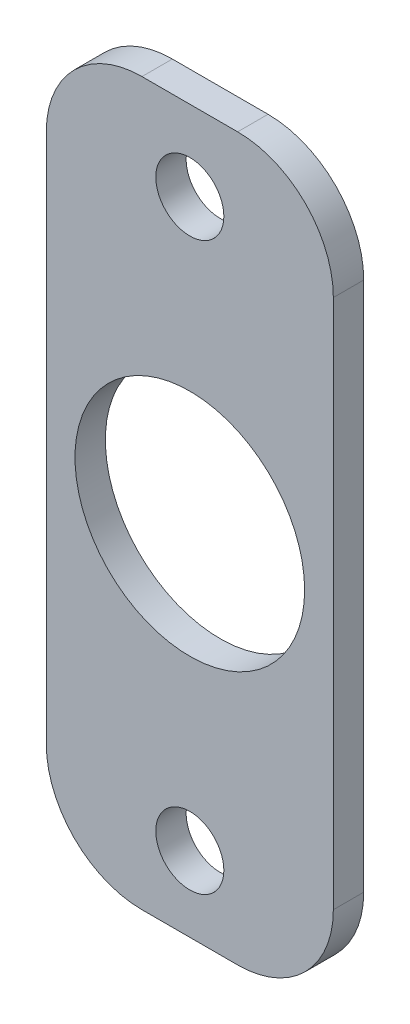
ISO-10303-21;
HEADER;
FILE_DESCRIPTION(('STEP AP214'),'2;1');
FILE_NAME('part.step','',(''),(''),'','','');
FILE_SCHEMA(('AUTOMOTIVE_DESIGN { 1 0 10303 214 1 1 1 1 }'));
ENDSEC;
DATA;
#1=APPLICATION_CONTEXT('core data for automotive mechanical design processes');
#2=APPLICATION_PROTOCOL_DEFINITION('international standard','automotive_design',2000,#1);
#3=PRODUCT_CONTEXT('',#1,'mechanical');
#4=PRODUCT('Part','Part','',(#3));
#5=PRODUCT_RELATED_PRODUCT_CATEGORY('part','',(#4));
#6=PRODUCT_DEFINITION_FORMATION('','',#4);
#7=PRODUCT_DEFINITION_CONTEXT('part definition',#1,'design');
#8=PRODUCT_DEFINITION('design','',#6,#7);
#9=PRODUCT_DEFINITION_SHAPE('','',#8);
#10=(LENGTH_UNIT() NAMED_UNIT(*) SI_UNIT(.MILLI.,.METRE.));
#11=(NAMED_UNIT(*) PLANE_ANGLE_UNIT() SI_UNIT($,.RADIAN.));
#12=(NAMED_UNIT(*) SI_UNIT($,.STERADIAN.) SOLID_ANGLE_UNIT());
#13=UNCERTAINTY_MEASURE_WITH_UNIT(LENGTH_MEASURE(1.E-05),#10,'distance_accuracy_value','');
#14=(GEOMETRIC_REPRESENTATION_CONTEXT(3) GLOBAL_UNCERTAINTY_ASSIGNED_CONTEXT((#13)) GLOBAL_UNIT_ASSIGNED_CONTEXT((#10,
#11,#12)) REPRESENTATION_CONTEXT('',''));
#15=CARTESIAN_POINT('',(0.,0.,0.));
#16=DIRECTION('',(0.,0.,1.));
#17=DIRECTION('',(1.,0.,0.));
#18=AXIS2_PLACEMENT_3D('',#15,#16,#17);
#19=CARTESIAN_POINT('',(0.,0.,1.5875));
#20=DIRECTION('',(0.,0.,1.));
#21=DIRECTION('',(1.,0.,0.));
#22=AXIS2_PLACEMENT_3D('',#19,#20,#21);
#23=PLANE('',#22);
#24=DIRECTION('',(-1.,0.,0.));
#25=VECTOR('',#24,1.);
#26=CARTESIAN_POINT('',(-100.593233082707,32.845393513352,1.5875));
#27=LINE('',#26,#25);
#28=CARTESIAN_POINT('',(-105.593233082707,32.845393513352,1.5875));
#29=VERTEX_POINT('',#28);
#30=CARTESIAN_POINT('',(-110.593233082707,32.845393513352,1.5875));
#31=VERTEX_POINT('',#30);
#32=EDGE_CURVE('E124',#29,#31,#27,.T.);
#33=ORIENTED_EDGE('',*,*,#32,.F.);
#34=CARTESIAN_POINT('',(-105.593233082707,37.845393513352,1.5875));
#35=DIRECTION('',(0.,0.,1.));
#36=DIRECTION('',(1.,0.,0.));
#37=AXIS2_PLACEMENT_3D('',#34,#35,#36);
#38=CIRCLE('',#37,5.);
#39=CARTESIAN_POINT('',(-100.593233082707,37.845393513352,1.5875));
#40=VERTEX_POINT('',#39);
#41=EDGE_CURVE('E107',#29,#40,#38,.T.);
#42=ORIENTED_EDGE('',*,*,#41,.T.);
#43=DIRECTION('',(0.,-1.,0.));
#44=VECTOR('',#43,1.);
#45=CARTESIAN_POINT('',(-100.593233082707,102.363909774436,1.5875));
#46=LINE('',#45,#44);
#47=CARTESIAN_POINT('',(-100.593233082707,65.5472195459643,1.5875));
#48=VERTEX_POINT('',#47);
#49=EDGE_CURVE('E139',#48,#40,#46,.T.);
#50=ORIENTED_EDGE('',*,*,#49,.F.);
#51=CARTESIAN_POINT('',(-105.593233082707,65.5472195459643,1.5875));
#52=DIRECTION('',(0.,0.,1.));
#53=DIRECTION('',(1.,0.,0.));
#54=AXIS2_PLACEMENT_3D('',#51,#52,#53);
#55=CIRCLE('',#54,5.);
#56=CARTESIAN_POINT('',(-105.593233082707,70.5472195459643,1.5875));
#57=VERTEX_POINT('',#56);
#58=EDGE_CURVE('E128',#48,#57,#55,.T.);
#59=ORIENTED_EDGE('',*,*,#58,.T.);
#60=DIRECTION('',(1.,0.,0.));
#61=VECTOR('',#60,1.);
#62=CARTESIAN_POINT('',(-115.593233082707,70.5472195459643,1.5875));
#63=LINE('',#62,#61);
#64=CARTESIAN_POINT('',(-110.593233082707,70.5472195459643,1.5875));
#65=VERTEX_POINT('',#64);
#66=EDGE_CURVE('E134',#65,#57,#63,.T.);
#67=ORIENTED_EDGE('',*,*,#66,.F.);
#68=CARTESIAN_POINT('',(-110.593233082707,65.5472195459643,1.5875));
#69=DIRECTION('',(0.,0.,1.));
#70=DIRECTION('',(1.,0.,0.));
#71=AXIS2_PLACEMENT_3D('',#68,#69,#70);
#72=CIRCLE('',#71,5.);
#73=CARTESIAN_POINT('',(-115.593233082707,65.5472195459643,1.5875));
#74=VERTEX_POINT('',#73);
#75=EDGE_CURVE('E170',#65,#74,#72,.T.);
#76=ORIENTED_EDGE('',*,*,#75,.T.);
#77=DIRECTION('',(0.,1.,0.));
#78=VECTOR('',#77,1.);
#79=CARTESIAN_POINT('',(-115.593233082707,102.363909774436,1.5875));
#80=LINE('',#79,#78);
#81=CARTESIAN_POINT('',(-115.593233082707,37.845393513352,1.5875));
#82=VERTEX_POINT('',#81);
#83=EDGE_CURVE('E144',#82,#74,#80,.T.);
#84=ORIENTED_EDGE('',*,*,#83,.F.);
#85=CARTESIAN_POINT('',(-110.593233082707,37.845393513352,1.5875));
#86=DIRECTION('',(0.,0.,1.));
#87=DIRECTION('',(1.,0.,0.));
#88=AXIS2_PLACEMENT_3D('',#85,#86,#87);
#89=CIRCLE('',#88,5.);
#90=EDGE_CURVE('E118',#82,#31,#89,.T.);
#91=ORIENTED_EDGE('',*,*,#90,.T.);
#92=EDGE_LOOP('',(#33,#42,#50,#59,#67,#76,#84,#91));
#93=FACE_BOUND('',#92,.T.);
#94=CARTESIAN_POINT('',(-108.093233082707,36.7675779244361,1.5875));
#95=DIRECTION('',(0.,0.,1.));
#96=DIRECTION('',(1.,0.,0.));
#97=AXIS2_PLACEMENT_3D('',#94,#95,#96);
#98=CIRCLE('',#97,1.77800000000001);
#99=CARTESIAN_POINT('',(-106.315233082707,36.7675779244361,1.5875));
#100=VERTEX_POINT('',#99);
#101=EDGE_CURVE('E148',#100,#100,#98,.T.);
#102=ORIENTED_EDGE('',*,*,#101,.F.);
#103=EDGE_LOOP('',(#102));
#104=FACE_BOUND('',#103,.T.);
#105=CARTESIAN_POINT('',(-108.093233082707,66.3602416244361,1.5875));
#106=DIRECTION('',(0.,0.,1.));
#107=DIRECTION('',(1.,0.,0.));
#108=AXIS2_PLACEMENT_3D('',#105,#106,#107);
#109=CIRCLE('',#108,1.778);
#110=CARTESIAN_POINT('',(-106.315233082707,66.3602416244361,1.5875));
#111=VERTEX_POINT('',#110);
#112=EDGE_CURVE('E154',#111,#111,#109,.T.);
#113=ORIENTED_EDGE('',*,*,#112,.F.);
#114=EDGE_LOOP('',(#113));
#115=FACE_BOUND('',#114,.T.);
#116=CARTESIAN_POINT('',(-108.093233082707,51.5639097744361,1.5875));
#117=DIRECTION('',(0.,0.,1.));
#118=DIRECTION('',(1.,0.,0.));
#119=AXIS2_PLACEMENT_3D('',#116,#117,#118);
#120=CIRCLE('',#119,5.99999993800001);
#121=CARTESIAN_POINT('',(-102.093233144707,51.5639097744361,1.5875));
#122=VERTEX_POINT('',#121);
#123=EDGE_CURVE('E160',#122,#122,#120,.T.);
#124=ORIENTED_EDGE('',*,*,#123,.F.);
#125=EDGE_LOOP('',(#124));
#126=FACE_BOUND('',#125,.T.);
#127=ADVANCED_FACE('F41',(#93,#104,#115,#126),#23,.T.);
#128=CARTESIAN_POINT('',(0.,0.,0.));
#129=DIRECTION('',(0.,0.,1.));
#130=DIRECTION('',(1.,0.,0.));
#131=AXIS2_PLACEMENT_3D('',#128,#129,#130);
#132=PLANE('',#131);
#133=CARTESIAN_POINT('',(-108.093233082707,36.7675779244361,0.));
#134=DIRECTION('',(0.,0.,1.));
#135=DIRECTION('',(1.,0.,0.));
#136=AXIS2_PLACEMENT_3D('',#133,#134,#135);
#137=CIRCLE('',#136,1.77800000000001);
#138=CARTESIAN_POINT('',(-106.315233082707,36.7675779244361,0.));
#139=VERTEX_POINT('',#138);
#140=EDGE_CURVE('E151',#139,#139,#137,.T.);
#141=ORIENTED_EDGE('',*,*,#140,.T.);
#142=EDGE_LOOP('',(#141));
#143=FACE_BOUND('',#142,.T.);
#144=CARTESIAN_POINT('',(-108.093233082707,66.3602416244361,0.));
#145=DIRECTION('',(0.,0.,1.));
#146=DIRECTION('',(1.,0.,0.));
#147=AXIS2_PLACEMENT_3D('',#144,#145,#146);
#148=CIRCLE('',#147,1.778);
#149=CARTESIAN_POINT('',(-106.315233082707,66.3602416244361,0.));
#150=VERTEX_POINT('',#149);
#151=EDGE_CURVE('E157',#150,#150,#148,.T.);
#152=ORIENTED_EDGE('',*,*,#151,.T.);
#153=EDGE_LOOP('',(#152));
#154=FACE_BOUND('',#153,.T.);
#155=CARTESIAN_POINT('',(-108.093233082707,51.5639097744361,0.));
#156=DIRECTION('',(0.,0.,1.));
#157=DIRECTION('',(1.,0.,0.));
#158=AXIS2_PLACEMENT_3D('',#155,#156,#157);
#159=CIRCLE('',#158,5.99999993800001);
#160=CARTESIAN_POINT('',(-102.093233144707,51.5639097744361,0.));
#161=VERTEX_POINT('',#160);
#162=EDGE_CURVE('E163',#161,#161,#159,.T.);
#163=ORIENTED_EDGE('',*,*,#162,.T.);
#164=EDGE_LOOP('',(#163));
#165=FACE_BOUND('',#164,.T.);
#166=DIRECTION('',(0.,-1.,0.));
#167=VECTOR('',#166,1.);
#168=CARTESIAN_POINT('',(-100.593233082707,102.363909774436,0.));
#169=LINE('',#168,#167);
#170=CARTESIAN_POINT('',(-100.593233082707,65.5472195459643,0.));
#171=VERTEX_POINT('',#170);
#172=CARTESIAN_POINT('',(-100.593233082707,37.845393513352,0.));
#173=VERTEX_POINT('',#172);
#174=EDGE_CURVE('E141',#171,#173,#169,.T.);
#175=ORIENTED_EDGE('',*,*,#174,.T.);
#176=CARTESIAN_POINT('',(-105.593233082707,37.845393513352,0.));
#177=DIRECTION('',(0.,0.,1.));
#178=DIRECTION('',(1.,0.,0.));
#179=AXIS2_PLACEMENT_3D('',#176,#177,#178);
#180=CIRCLE('',#179,5.);
#181=CARTESIAN_POINT('',(-105.593233082707,32.845393513352,0.));
#182=VERTEX_POINT('',#181);
#183=EDGE_CURVE('E181',#173,#182,#180,.F.);
#184=ORIENTED_EDGE('',*,*,#183,.T.);
#185=DIRECTION('',(-1.,0.,0.));
#186=VECTOR('',#185,1.);
#187=CARTESIAN_POINT('',(-100.593233082707,32.845393513352,0.));
#188=LINE('',#187,#186);
#189=CARTESIAN_POINT('',(-110.593233082707,32.845393513352,0.));
#190=VERTEX_POINT('',#189);
#191=EDGE_CURVE('E127',#182,#190,#188,.T.);
#192=ORIENTED_EDGE('',*,*,#191,.T.);
#193=CARTESIAN_POINT('',(-110.593233082707,37.845393513352,0.));
#194=DIRECTION('',(0.,0.,1.));
#195=DIRECTION('',(1.,0.,0.));
#196=AXIS2_PLACEMENT_3D('',#193,#194,#195);
#197=CIRCLE('',#196,5.);
#198=CARTESIAN_POINT('',(-115.593233082707,37.845393513352,0.));
#199=VERTEX_POINT('',#198);
#200=EDGE_CURVE('E179',#190,#199,#197,.F.);
#201=ORIENTED_EDGE('',*,*,#200,.T.);
#202=DIRECTION('',(0.,1.,0.));
#203=VECTOR('',#202,1.);
#204=CARTESIAN_POINT('',(-115.593233082707,102.363909774436,0.));
#205=LINE('',#204,#203);
#206=CARTESIAN_POINT('',(-115.593233082707,65.5472195459643,0.));
#207=VERTEX_POINT('',#206);
#208=EDGE_CURVE('E146',#199,#207,#205,.T.);
#209=ORIENTED_EDGE('',*,*,#208,.T.);
#210=CARTESIAN_POINT('',(-110.593233082707,65.5472195459643,0.));
#211=DIRECTION('',(0.,0.,1.));
#212=DIRECTION('',(1.,0.,0.));
#213=AXIS2_PLACEMENT_3D('',#210,#211,#212);
#214=CIRCLE('',#213,5.);
#215=CARTESIAN_POINT('',(-110.593233082707,70.5472195459643,0.));
#216=VERTEX_POINT('',#215);
#217=EDGE_CURVE('E62',#207,#216,#214,.F.);
#218=ORIENTED_EDGE('',*,*,#217,.T.);
#219=DIRECTION('',(1.,0.,0.));
#220=VECTOR('',#219,1.);
#221=CARTESIAN_POINT('',(-115.593233082707,70.5472195459643,0.));
#222=LINE('',#221,#220);
#223=CARTESIAN_POINT('',(-105.593233082707,70.5472195459643,0.));
#224=VERTEX_POINT('',#223);
#225=EDGE_CURVE('E137',#216,#224,#222,.T.);
#226=ORIENTED_EDGE('',*,*,#225,.T.);
#227=CARTESIAN_POINT('',(-105.593233082707,65.5472195459643,0.));
#228=DIRECTION('',(0.,0.,1.));
#229=DIRECTION('',(1.,0.,0.));
#230=AXIS2_PLACEMENT_3D('',#227,#228,#229);
#231=CIRCLE('',#230,5.);
#232=EDGE_CURVE('E176',#224,#171,#231,.F.);
#233=ORIENTED_EDGE('',*,*,#232,.T.);
#234=EDGE_LOOP('',(#175,#184,#192,#201,#209,#218,#226,#233));
#235=FACE_BOUND('',#234,.T.);
#236=ADVANCED_FACE('F200',(#143,#154,#165,#235),#132,.F.);
#237=CARTESIAN_POINT('',(-108.093233082707,51.5639097744361,0.));
#238=DIRECTION('',(0.,0.,1.));
#239=DIRECTION('',(1.,0.,0.));
#240=AXIS2_PLACEMENT_3D('',#237,#238,#239);
#241=CYLINDRICAL_SURFACE('',#240,5.99999993800001);
#242=ORIENTED_EDGE('',*,*,#162,.F.);
#243=EDGE_LOOP('',(#242));
#244=FACE_BOUND('',#243,.T.);
#245=ORIENTED_EDGE('',*,*,#123,.T.);
#246=EDGE_LOOP('',(#245));
#247=FACE_BOUND('',#246,.T.);
#248=ADVANCED_FACE('F220',(#244,#247),#241,.F.);
#249=CARTESIAN_POINT('',(-108.093233082707,66.3602416244361,0.));
#250=DIRECTION('',(0.,0.,1.));
#251=DIRECTION('',(1.,0.,0.));
#252=AXIS2_PLACEMENT_3D('',#249,#250,#251);
#253=CYLINDRICAL_SURFACE('',#252,1.778);
#254=ORIENTED_EDGE('',*,*,#151,.F.);
#255=EDGE_LOOP('',(#254));
#256=FACE_BOUND('',#255,.T.);
#257=ORIENTED_EDGE('',*,*,#112,.T.);
#258=EDGE_LOOP('',(#257));
#259=FACE_BOUND('',#258,.T.);
#260=ADVANCED_FACE('F226',(#256,#259),#253,.F.);
#261=CARTESIAN_POINT('',(-108.093233082707,36.7675779244361,0.));
#262=DIRECTION('',(0.,0.,1.));
#263=DIRECTION('',(1.,0.,0.));
#264=AXIS2_PLACEMENT_3D('',#261,#262,#263);
#265=CYLINDRICAL_SURFACE('',#264,1.77800000000001);
#266=ORIENTED_EDGE('',*,*,#140,.F.);
#267=EDGE_LOOP('',(#266));
#268=FACE_BOUND('',#267,.T.);
#269=ORIENTED_EDGE('',*,*,#101,.T.);
#270=EDGE_LOOP('',(#269));
#271=FACE_BOUND('',#270,.T.);
#272=ADVANCED_FACE('F230',(#268,#271),#265,.F.);
#273=CARTESIAN_POINT('',(-115.593233082707,102.363909774436,0.));
#274=DIRECTION('',(1.,0.,0.));
#275=DIRECTION('',(0.,0.,-1.));
#276=AXIS2_PLACEMENT_3D('',#273,#274,#275);
#277=PLANE('',#276);
#278=ORIENTED_EDGE('',*,*,#208,.F.);
#279=DIRECTION('',(0.,0.,1.));
#280=VECTOR('',#279,1.);
#281=CARTESIAN_POINT('',(-115.593233082707,37.845393513352,0.));
#282=LINE('',#281,#280);
#283=EDGE_CURVE('E185',#199,#82,#282,.T.);
#284=ORIENTED_EDGE('',*,*,#283,.T.);
#285=ORIENTED_EDGE('',*,*,#83,.T.);
#286=DIRECTION('',(0.,0.,1.));
#287=VECTOR('',#286,1.);
#288=CARTESIAN_POINT('',(-115.593233082707,65.5472195459643,0.));
#289=LINE('',#288,#287);
#290=EDGE_CURVE('E183',#74,#207,#289,.F.);
#291=ORIENTED_EDGE('',*,*,#290,.T.);
#292=EDGE_LOOP('',(#278,#284,#285,#291));
#293=FACE_BOUND('',#292,.T.);
#294=ADVANCED_FACE('F190',(#293),#277,.F.);
#295=CARTESIAN_POINT('',(-100.593233082707,102.363909774436,0.));
#296=DIRECTION('',(-1.,0.,0.));
#297=DIRECTION('',(0.,0.,1.));
#298=AXIS2_PLACEMENT_3D('',#295,#296,#297);
#299=PLANE('',#298);
#300=ORIENTED_EDGE('',*,*,#49,.T.);
#301=DIRECTION('',(0.,0.,1.));
#302=VECTOR('',#301,1.);
#303=CARTESIAN_POINT('',(-100.593233082707,37.845393513352,0.));
#304=LINE('',#303,#302);
#305=EDGE_CURVE('E112',#40,#173,#304,.F.);
#306=ORIENTED_EDGE('',*,*,#305,.T.);
#307=ORIENTED_EDGE('',*,*,#174,.F.);
#308=DIRECTION('',(0.,0.,1.));
#309=VECTOR('',#308,1.);
#310=CARTESIAN_POINT('',(-100.593233082707,65.5472195459643,0.));
#311=LINE('',#310,#309);
#312=EDGE_CURVE('E117',#171,#48,#311,.T.);
#313=ORIENTED_EDGE('',*,*,#312,.T.);
#314=EDGE_LOOP('',(#300,#306,#307,#313));
#315=FACE_BOUND('',#314,.T.);
#316=ADVANCED_FACE('F205',(#315),#299,.F.);
#317=CARTESIAN_POINT('',(-115.593233082707,70.5472195459643,0.));
#318=DIRECTION('',(0.,-1.,0.));
#319=DIRECTION('',(0.,0.,-1.));
#320=AXIS2_PLACEMENT_3D('',#317,#318,#319);
#321=PLANE('',#320);
#322=ORIENTED_EDGE('',*,*,#225,.F.);
#323=DIRECTION('',(0.,0.,1.));
#324=VECTOR('',#323,1.);
#325=CARTESIAN_POINT('',(-110.593233082707,70.5472195459643,0.));
#326=LINE('',#325,#324);
#327=EDGE_CURVE('E11',#216,#65,#326,.T.);
#328=ORIENTED_EDGE('',*,*,#327,.T.);
#329=ORIENTED_EDGE('',*,*,#66,.T.);
#330=DIRECTION('',(0.,0.,1.));
#331=VECTOR('',#330,1.);
#332=CARTESIAN_POINT('',(-105.593233082707,70.5472195459643,0.));
#333=LINE('',#332,#331);
#334=EDGE_CURVE('E49',#57,#224,#333,.F.);
#335=ORIENTED_EDGE('',*,*,#334,.T.);
#336=EDGE_LOOP('',(#322,#328,#329,#335));
#337=FACE_BOUND('',#336,.T.);
#338=ADVANCED_FACE('F198',(#337),#321,.F.);
#339=CARTESIAN_POINT('',(-100.593233082707,32.845393513352,0.));
#340=DIRECTION('',(0.,1.,0.));
#341=DIRECTION('',(0.,0.,1.));
#342=AXIS2_PLACEMENT_3D('',#339,#340,#341);
#343=PLANE('',#342);
#344=ORIENTED_EDGE('',*,*,#191,.F.);
#345=DIRECTION('',(0.,0.,1.));
#346=VECTOR('',#345,1.);
#347=CARTESIAN_POINT('',(-105.593233082707,32.845393513352,0.));
#348=LINE('',#347,#346);
#349=EDGE_CURVE('E111',#182,#29,#348,.T.);
#350=ORIENTED_EDGE('',*,*,#349,.T.);
#351=ORIENTED_EDGE('',*,*,#32,.T.);
#352=DIRECTION('',(0.,0.,1.));
#353=VECTOR('',#352,1.);
#354=CARTESIAN_POINT('',(-110.593233082707,32.845393513352,0.));
#355=LINE('',#354,#353);
#356=EDGE_CURVE('E129',#31,#190,#355,.F.);
#357=ORIENTED_EDGE('',*,*,#356,.T.);
#358=EDGE_LOOP('',(#344,#350,#351,#357));
#359=FACE_BOUND('',#358,.T.);
#360=ADVANCED_FACE('F123',(#359),#343,.F.);
#361=CARTESIAN_POINT('',(-105.593233082707,37.845393513352,0.));
#362=DIRECTION('',(0.,0.,1.));
#363=DIRECTION('',(1.,0.,0.));
#364=AXIS2_PLACEMENT_3D('',#361,#362,#363);
#365=CYLINDRICAL_SURFACE('',#364,5.);
#366=ORIENTED_EDGE('',*,*,#183,.F.);
#367=ORIENTED_EDGE('',*,*,#305,.F.);
#368=ORIENTED_EDGE('',*,*,#41,.F.);
#369=ORIENTED_EDGE('',*,*,#349,.F.);
#370=EDGE_LOOP('',(#366,#367,#368,#369));
#371=FACE_BOUND('',#370,.T.);
#372=ADVANCED_FACE('F110',(#371),#365,.T.);
#373=CARTESIAN_POINT('',(-110.593233082707,37.845393513352,0.));
#374=DIRECTION('',(0.,0.,1.));
#375=DIRECTION('',(1.,0.,0.));
#376=AXIS2_PLACEMENT_3D('',#373,#374,#375);
#377=CYLINDRICAL_SURFACE('',#376,5.);
#378=ORIENTED_EDGE('',*,*,#200,.F.);
#379=ORIENTED_EDGE('',*,*,#356,.F.);
#380=ORIENTED_EDGE('',*,*,#90,.F.);
#381=ORIENTED_EDGE('',*,*,#283,.F.);
#382=EDGE_LOOP('',(#378,#379,#380,#381));
#383=FACE_BOUND('',#382,.T.);
#384=ADVANCED_FACE('F206',(#383),#377,.T.);
#385=CARTESIAN_POINT('',(-110.593233082707,65.5472195459643,0.));
#386=DIRECTION('',(0.,0.,1.));
#387=DIRECTION('',(1.,0.,0.));
#388=AXIS2_PLACEMENT_3D('',#385,#386,#387);
#389=CYLINDRICAL_SURFACE('',#388,5.);
#390=ORIENTED_EDGE('',*,*,#217,.F.);
#391=ORIENTED_EDGE('',*,*,#290,.F.);
#392=ORIENTED_EDGE('',*,*,#75,.F.);
#393=ORIENTED_EDGE('',*,*,#327,.F.);
#394=EDGE_LOOP('',(#390,#391,#392,#393));
#395=FACE_BOUND('',#394,.T.);
#396=ADVANCED_FACE('F197',(#395),#389,.T.);
#397=CARTESIAN_POINT('',(-105.593233082707,65.5472195459643,0.));
#398=DIRECTION('',(0.,0.,1.));
#399=DIRECTION('',(1.,0.,0.));
#400=AXIS2_PLACEMENT_3D('',#397,#398,#399);
#401=CYLINDRICAL_SURFACE('',#400,5.);
#402=ORIENTED_EDGE('',*,*,#232,.F.);
#403=ORIENTED_EDGE('',*,*,#334,.F.);
#404=ORIENTED_EDGE('',*,*,#58,.F.);
#405=ORIENTED_EDGE('',*,*,#312,.F.);
#406=EDGE_LOOP('',(#402,#403,#404,#405));
#407=FACE_BOUND('',#406,.T.);
#408=ADVANCED_FACE('F43',(#407),#401,.T.);
#409=CLOSED_SHELL('',(#127,#236,#248,#260,#272,#294,#316,#338,#360,#372,#384,#396,#408));
#410=MANIFOLD_SOLID_BREP('B2',#409);
#411=ADVANCED_BREP_SHAPE_REPRESENTATION('',(#18,#410),#14);
#412=SHAPE_DEFINITION_REPRESENTATION(#9,#411);
ENDSEC;
END-ISO-10303-21;
